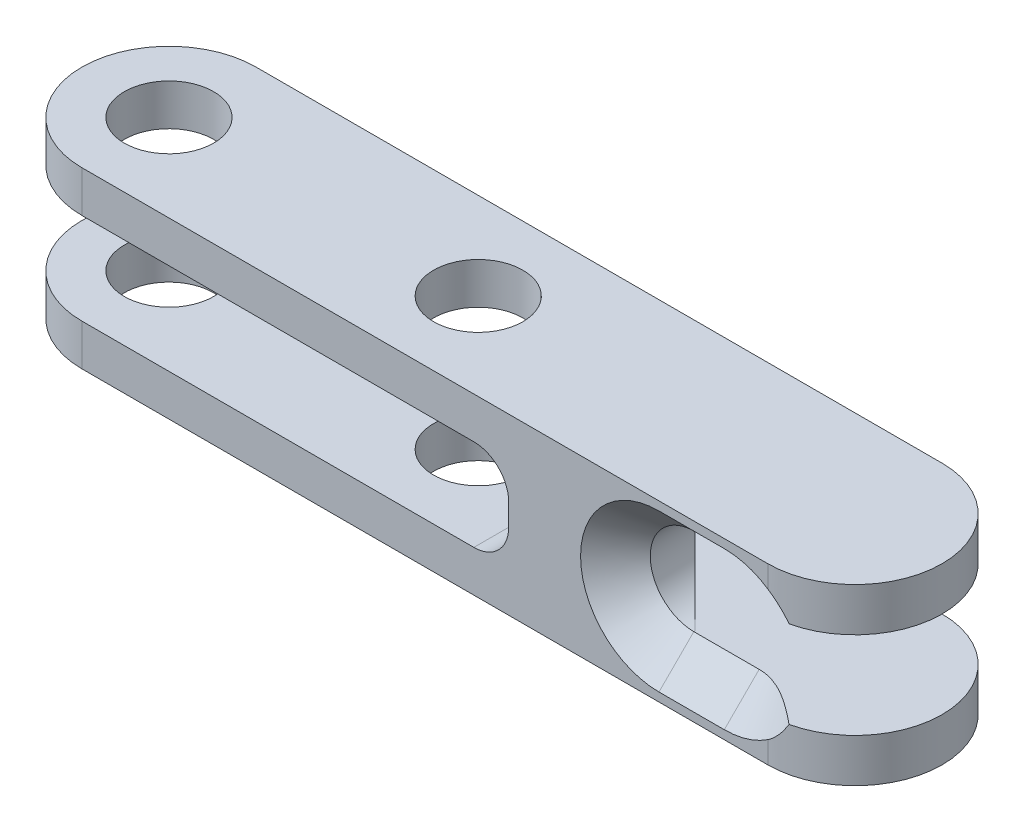
ISO-10303-21;
HEADER;
FILE_DESCRIPTION(('STEP AP214'),'2;1');
FILE_NAME('part.step','',(''),(''),'','','');
FILE_SCHEMA(('AUTOMOTIVE_DESIGN { 1 0 10303 214 1 1 1 1 }'));
ENDSEC;
DATA;
#1=APPLICATION_CONTEXT('core data for automotive mechanical design processes');
#2=APPLICATION_PROTOCOL_DEFINITION('international standard','automotive_design',2000,#1);
#3=PRODUCT_CONTEXT('',#1,'mechanical');
#4=PRODUCT('Part','Part','',(#3));
#5=PRODUCT_RELATED_PRODUCT_CATEGORY('part','',(#4));
#6=PRODUCT_DEFINITION_FORMATION('','',#4);
#7=PRODUCT_DEFINITION_CONTEXT('part definition',#1,'design');
#8=PRODUCT_DEFINITION('design','',#6,#7);
#9=PRODUCT_DEFINITION_SHAPE('','',#8);
#10=(LENGTH_UNIT() NAMED_UNIT(*) SI_UNIT(.MILLI.,.METRE.));
#11=(NAMED_UNIT(*) PLANE_ANGLE_UNIT() SI_UNIT($,.RADIAN.));
#12=(NAMED_UNIT(*) SI_UNIT($,.STERADIAN.) SOLID_ANGLE_UNIT());
#13=UNCERTAINTY_MEASURE_WITH_UNIT(LENGTH_MEASURE(1.E-05),#10,'distance_accuracy_value','');
#14=(GEOMETRIC_REPRESENTATION_CONTEXT(3) GLOBAL_UNCERTAINTY_ASSIGNED_CONTEXT((#13)) GLOBAL_UNIT_ASSIGNED_CONTEXT((#10,
#11,#12)) REPRESENTATION_CONTEXT('',''));
#15=CARTESIAN_POINT('',(0.,0.,0.));
#16=DIRECTION('',(0.,0.,1.));
#17=DIRECTION('',(1.,0.,0.));
#18=AXIS2_PLACEMENT_3D('',#15,#16,#17);
#19=CARTESIAN_POINT('',(11.,0.,8.));
#20=DIRECTION('',(0.,0.,1.));
#21=DIRECTION('',(-1.,0.,0.));
#22=AXIS2_PLACEMENT_3D('',#19,#20,#21);
#23=CYLINDRICAL_SURFACE('',#22,2.);
#24=DIRECTION('',(0.,0.,-1.));
#25=VECTOR('',#24,1.);
#26=CARTESIAN_POINT('',(11.,2.,6.4));
#27=LINE('',#26,#25);
#28=CARTESIAN_POINT('',(11.,2.,6.4));
#29=VERTEX_POINT('',#28);
#30=CARTESIAN_POINT('',(11.,2.,6.35391052434));
#31=VERTEX_POINT('',#30);
#32=EDGE_CURVE('E172',#29,#31,#27,.T.);
#33=ORIENTED_EDGE('',*,*,#32,.F.);
#34=CARTESIAN_POINT('',(11.,0.,6.4));
#35=DIRECTION('',(0.,0.,1.));
#36=DIRECTION('',(0.,1.,0.));
#37=AXIS2_PLACEMENT_3D('',#34,#35,#36);
#38=CIRCLE('',#37,2.);
#39=CARTESIAN_POINT('',(11.,-2.,6.4));
#40=VERTEX_POINT('',#39);
#41=EDGE_CURVE('E385',#29,#40,#38,.T.);
#42=ORIENTED_EDGE('',*,*,#41,.T.);
#43=DIRECTION('',(0.,0.,-1.));
#44=VECTOR('',#43,1.);
#45=CARTESIAN_POINT('',(11.,-2.,6.4));
#46=LINE('',#45,#44);
#47=CARTESIAN_POINT('',(11.,-2.,6.35391052434));
#48=VERTEX_POINT('',#47);
#49=EDGE_CURVE('E11',#40,#48,#46,.T.);
#50=ORIENTED_EDGE('',*,*,#49,.T.);
#51=CARTESIAN_POINT('',(11.,0.,6.35391052434));
#52=DIRECTION('',(-0.707106781186548,0.,0.707106781186548));
#53=DIRECTION('',(0.707106781186548,0.,0.707106781186548));
#54=AXIS2_PLACEMENT_3D('',#51,#52,#53);
#55=ELLIPSE('',#54,2.82842712474619,2.);
#56=EDGE_CURVE('E28',#31,#48,#55,.T.);
#57=ORIENTED_EDGE('',*,*,#56,.F.);
#58=EDGE_LOOP('',(#33,#42,#50,#57));
#59=FACE_BOUND('',#58,.T.);
#60=ADVANCED_FACE('F17',(#59),#23,.F.);
#61=CARTESIAN_POINT('',(11.,-2.,8.));
#62=DIRECTION('',(0.,-1.,0.));
#63=DIRECTION('',(0.,0.,-1.));
#64=AXIS2_PLACEMENT_3D('',#61,#62,#63);
#65=PLANE('',#64);
#66=CARTESIAN_POINT('',(16.8758536968895,-2.,7.90293226967255));
#67=CARTESIAN_POINT('',(15.0452077386955,-2.,6.4));
#68=CARTESIAN_POINT('',(14.,-2.,6.4));
#69=(BOUNDED_CURVE() B_SPLINE_CURVE(2,(#66,#67,#68),.UNSPECIFIED.,.F.,
.F.) B_SPLINE_CURVE_WITH_KNOTS((3,3),(0.0819922701807436,0.489367274751613),
.UNSPECIFIED.) CURVE() GEOMETRIC_REPRESENTATION_ITEM() RATIONAL_B_SPLINE_CURVE((1.1997142402842,
1.6504865518114,1.6504865518114)) REPRESENTATION_ITEM(''));
#70=CARTESIAN_POINT('',(16.87585369689,-2.,7.902932269672));
#71=VERTEX_POINT('',#70);
#72=CARTESIAN_POINT('',(14.,-2.,6.4));
#73=VERTEX_POINT('',#72);
#74=EDGE_CURVE('E498',#71,#73,#69,.T.);
#75=ORIENTED_EDGE('',*,*,#74,.F.);
#76=CARTESIAN_POINT('',(16.,-2.,4.));
#77=DIRECTION('',(0.,-1.,0.));
#78=DIRECTION('',(0.,0.,-1.));
#79=AXIS2_PLACEMENT_3D('',#76,#77,#78);
#80=CIRCLE('',#79,4.);
#81=CARTESIAN_POINT('',(16.,-2.,0.));
#82=VERTEX_POINT('',#81);
#83=EDGE_CURVE('E359',#82,#71,#80,.T.);
#84=ORIENTED_EDGE('',*,*,#83,.F.);
#85=DIRECTION('',(1.,0.,0.));
#86=VECTOR('',#85,1.);
#87=CARTESIAN_POINT('',(4.64608947566,-2.,0.));
#88=LINE('',#87,#86);
#89=CARTESIAN_POINT('',(4.64608947566,-2.,0.));
#90=VERTEX_POINT('',#89);
#91=EDGE_CURVE('E268',#90,#82,#88,.T.);
#92=ORIENTED_EDGE('',*,*,#91,.F.);
#93=DIRECTION('',(0.707106781186548,0.,0.707106781186548));
#94=VECTOR('',#93,1.);
#95=CARTESIAN_POINT('',(4.64608947566,-2.,0.));
#96=LINE('',#95,#94);
#97=EDGE_CURVE('E255',#90,#48,#96,.T.);
#98=ORIENTED_EDGE('',*,*,#97,.T.);
#99=ORIENTED_EDGE('',*,*,#49,.F.);
#100=DIRECTION('',(-1.,0.,0.));
#101=VECTOR('',#100,1.);
#102=CARTESIAN_POINT('',(14.,-2.,6.4));
#103=LINE('',#102,#101);
#104=EDGE_CURVE('E339',#73,#40,#103,.T.);
#105=ORIENTED_EDGE('',*,*,#104,.F.);
#106=EDGE_LOOP('',(#75,#84,#92,#98,#99,#105));
#107=FACE_BOUND('',#106,.T.);
#108=ADVANCED_FACE('F553',(#107),#65,.F.);
#109=CARTESIAN_POINT('',(8.32304473783,0.,3.67695526217));
#110=DIRECTION('',(-0.707106781186548,0.,0.707106781186548));
#111=DIRECTION('',(0.,1.,0.));
#112=AXIS2_PLACEMENT_3D('',#109,#110,#111);
#113=PLANE('',#112);
#114=ORIENTED_EDGE('',*,*,#97,.F.);
#115=DIRECTION('',(0.,-1.,0.));
#116=VECTOR('',#115,1.);
#117=CARTESIAN_POINT('',(4.64608947566,2.,0.));
#118=LINE('',#117,#116);
#119=CARTESIAN_POINT('',(4.64608947566,2.,0.));
#120=VERTEX_POINT('',#119);
#121=EDGE_CURVE('E273',#120,#90,#118,.T.);
#122=ORIENTED_EDGE('',*,*,#121,.F.);
#123=DIRECTION('',(-0.707106781186548,0.,-0.707106781186548));
#124=VECTOR('',#123,1.);
#125=CARTESIAN_POINT('',(11.,2.,6.35391052434));
#126=LINE('',#125,#124);
#127=EDGE_CURVE('E253',#31,#120,#126,.T.);
#128=ORIENTED_EDGE('',*,*,#127,.F.);
#129=ORIENTED_EDGE('',*,*,#56,.T.);
#130=EDGE_LOOP('',(#114,#122,#128,#129));
#131=FACE_BOUND('',#130,.T.);
#132=ADVANCED_FACE('F19',(#131),#113,.F.);
#133=CARTESIAN_POINT('',(20.,2.,8.));
#134=DIRECTION('',(0.,1.,0.));
#135=DIRECTION('',(1.,0.,0.));
#136=AXIS2_PLACEMENT_3D('',#133,#134,#135);
#137=PLANE('',#136);
#138=CARTESIAN_POINT('',(14.,2.,6.4));
#139=CARTESIAN_POINT('',(15.0452077386892,2.,6.4));
#140=CARTESIAN_POINT('',(16.8758536968591,2.,7.90293226964759));
#141=(BOUNDED_CURVE() B_SPLINE_CURVE(2,(#138,#139,#140),.UNSPECIFIED.,.F.,
.F.) B_SPLINE_CURVE_WITH_KNOTS((3,3),(0.489367274751613,0.896742279320024),
.UNSPECIFIED.) CURVE() GEOMETRIC_REPRESENTATION_ITEM() RATIONAL_B_SPLINE_CURVE((1.6504865518114,
1.6504865518114,1.19971424028964)) REPRESENTATION_ITEM(''));
#142=CARTESIAN_POINT('',(14.,2.,6.4));
#143=VERTEX_POINT('',#142);
#144=CARTESIAN_POINT('',(16.87585369689,2.,7.902932269672));
#145=VERTEX_POINT('',#144);
#146=EDGE_CURVE('E335',#143,#145,#141,.T.);
#147=ORIENTED_EDGE('',*,*,#146,.F.);
#148=DIRECTION('',(1.,0.,0.));
#149=VECTOR('',#148,1.);
#150=CARTESIAN_POINT('',(11.,2.,6.4));
#151=LINE('',#150,#149);
#152=EDGE_CURVE('E254',#29,#143,#151,.T.);
#153=ORIENTED_EDGE('',*,*,#152,.F.);
#154=ORIENTED_EDGE('',*,*,#32,.T.);
#155=ORIENTED_EDGE('',*,*,#127,.T.);
#156=DIRECTION('',(-1.,0.,0.));
#157=VECTOR('',#156,1.);
#158=CARTESIAN_POINT('',(16.,2.,0.));
#159=LINE('',#158,#157);
#160=CARTESIAN_POINT('',(16.,2.,0.));
#161=VERTEX_POINT('',#160);
#162=EDGE_CURVE('E405',#161,#120,#159,.T.);
#163=ORIENTED_EDGE('',*,*,#162,.F.);
#164=CARTESIAN_POINT('',(16.,2.,4.));
#165=DIRECTION('',(0.,1.,0.));
#166=DIRECTION('',(0.218963424222194,0.,0.975733067417975));
#167=AXIS2_PLACEMENT_3D('',#164,#165,#166);
#168=CIRCLE('',#167,4.);
#169=EDGE_CURVE('E344',#145,#161,#168,.T.);
#170=ORIENTED_EDGE('',*,*,#169,.F.);
#171=EDGE_LOOP('',(#147,#153,#154,#155,#163,#170));
#172=FACE_BOUND('',#171,.T.);
#173=ADVANCED_FACE('F753',(#172),#137,.F.);
#174=CARTESIAN_POINT('',(14.,3.6,8.));
#175=DIRECTION('',(0.,0.707106781186548,-0.707106781186548));
#176=DIRECTION('',(-1.,0.,0.));
#177=AXIS2_PLACEMENT_3D('',#174,#175,#176);
#178=PLANE('',#177);
#179=DIRECTION('',(1.,0.,0.));
#180=VECTOR('',#179,1.);
#181=CARTESIAN_POINT('',(11.,3.6,8.));
#182=LINE('',#181,#180);
#183=CARTESIAN_POINT('',(11.,3.6,8.));
#184=VERTEX_POINT('',#183);
#185=CARTESIAN_POINT('',(14.,3.6,8.));
#186=VERTEX_POINT('',#185);
#187=EDGE_CURVE('E332',#184,#186,#182,.T.);
#188=ORIENTED_EDGE('',*,*,#187,.F.);
#189=DIRECTION('',(0.,-0.707106781186548,-0.707106781186548));
#190=VECTOR('',#189,1.);
#191=CARTESIAN_POINT('',(11.,3.6,8.));
#192=LINE('',#191,#190);
#193=EDGE_CURVE('E432',#184,#29,#192,.T.);
#194=ORIENTED_EDGE('',*,*,#193,.T.);
#195=ORIENTED_EDGE('',*,*,#152,.T.);
#196=DIRECTION('',(0.,-0.707106781186548,-0.707106781186548));
#197=VECTOR('',#196,1.);
#198=CARTESIAN_POINT('',(14.,3.6,8.));
#199=LINE('',#198,#197);
#200=EDGE_CURVE('E340',#186,#143,#199,.T.);
#201=ORIENTED_EDGE('',*,*,#200,.F.);
#202=EDGE_LOOP('',(#188,#194,#195,#201));
#203=FACE_BOUND('',#202,.T.);
#204=ADVANCED_FACE('F571',(#203),#178,.F.);
#205=CARTESIAN_POINT('',(11.,0.,7.2));
#206=DIRECTION('',(0.,0.,1.));
#207=DIRECTION('',(-1.,0.,0.));
#208=AXIS2_PLACEMENT_3D('',#205,#206,#207);
#209=CONICAL_SURFACE('',#208,2.8,0.785398163397448);
#210=CARTESIAN_POINT('',(11.,0.,8.));
#211=DIRECTION('',(0.,0.,1.));
#212=DIRECTION('',(0.,1.,0.));
#213=AXIS2_PLACEMENT_3D('',#210,#211,#212);
#214=CIRCLE('',#213,3.6);
#215=CARTESIAN_POINT('',(11.,-3.6,8.));
#216=VERTEX_POINT('',#215);
#217=EDGE_CURVE('E399',#184,#216,#214,.T.);
#218=ORIENTED_EDGE('',*,*,#217,.T.);
#219=DIRECTION('',(0.,0.707106781186548,-0.707106781186548));
#220=VECTOR('',#219,1.);
#221=CARTESIAN_POINT('',(11.,-3.6,8.));
#222=LINE('',#221,#220);
#223=EDGE_CURVE('E382',#216,#40,#222,.T.);
#224=ORIENTED_EDGE('',*,*,#223,.T.);
#225=ORIENTED_EDGE('',*,*,#41,.F.);
#226=ORIENTED_EDGE('',*,*,#193,.F.);
#227=EDGE_LOOP('',(#218,#224,#225,#226));
#228=FACE_BOUND('',#227,.T.);
#229=ADVANCED_FACE('F566',(#228),#209,.F.);
#230=CARTESIAN_POINT('',(11.,-3.6,8.));
#231=DIRECTION('',(0.,-0.707106781186548,-0.707106781186548));
#232=DIRECTION('',(0.,-0.707106781186548,0.707106781186548));
#233=AXIS2_PLACEMENT_3D('',#230,#231,#232);
#234=PLANE('',#233);
#235=DIRECTION('',(-1.,0.,0.));
#236=VECTOR('',#235,1.);
#237=CARTESIAN_POINT('',(14.,-3.6,8.));
#238=LINE('',#237,#236);
#239=CARTESIAN_POINT('',(14.,-3.6,8.));
#240=VERTEX_POINT('',#239);
#241=EDGE_CURVE('E396',#240,#216,#238,.T.);
#242=ORIENTED_EDGE('',*,*,#241,.F.);
#243=DIRECTION('',(0.,0.707106781186548,-0.707106781186548));
#244=VECTOR('',#243,1.);
#245=CARTESIAN_POINT('',(14.,-3.6,8.));
#246=LINE('',#245,#244);
#247=EDGE_CURVE('E491',#240,#73,#246,.T.);
#248=ORIENTED_EDGE('',*,*,#247,.T.);
#249=ORIENTED_EDGE('',*,*,#104,.T.);
#250=ORIENTED_EDGE('',*,*,#223,.F.);
#251=EDGE_LOOP('',(#242,#248,#249,#250));
#252=FACE_BOUND('',#251,.T.);
#253=ADVANCED_FACE('F307',(#252),#234,.F.);
#254=CARTESIAN_POINT('',(14.,0.,7.2));
#255=DIRECTION('',(0.,0.,1.));
#256=DIRECTION('',(1.,0.,0.));
#257=AXIS2_PLACEMENT_3D('',#254,#255,#256);
#258=CONICAL_SURFACE('',#257,2.8,0.785398163397448);
#259=CARTESIAN_POINT('',(14.,0.,8.));
#260=DIRECTION('',(0.,0.,1.));
#261=DIRECTION('',(0.555555555555585,0.831479419283078,0.));
#262=AXIS2_PLACEMENT_3D('',#259,#260,#261);
#263=CIRCLE('',#262,3.6);
#264=CARTESIAN_POINT('',(16.,2.993325909419,8.));
#265=VERTEX_POINT('',#264);
#266=EDGE_CURVE('E326',#265,#186,#263,.T.);
#267=ORIENTED_EDGE('',*,*,#266,.T.);
#268=ORIENTED_EDGE('',*,*,#200,.T.);
#269=ORIENTED_EDGE('',*,*,#146,.T.);
#270=CARTESIAN_POINT('',(16.0000000000001,2.9933259094191,8.));
#271=CARTESIAN_POINT('',(16.0224915069229,2.97829905344923,8.00000003885575));
#272=CARTESIAN_POINT('',(16.0447102397676,2.96286612871863,7.99981030326187));
#273=CARTESIAN_POINT('',(16.0887664823905,2.93109616731914,7.99907611899545));
#274=CARTESIAN_POINT('',(16.1105993066032,2.9147526976776,7.99852874360516));
#275=CARTESIAN_POINT('',(16.1538781539454,2.88116203598733,7.99709829343307));
#276=CARTESIAN_POINT('',(16.1753185723437,2.8639077634715,7.99621209528173));
#277=CARTESIAN_POINT('',(16.2178090094902,2.82849619626333,7.99412273839618));
#278=CARTESIAN_POINT('',(16.238852526575,2.81033129732153,7.99291633557615));
#279=CARTESIAN_POINT('',(16.2805457383029,2.77309893893066,7.99020495253355));
#280=CARTESIAN_POINT('',(16.3011880577053,2.75402346755369,7.98869667873485));
#281=CARTESIAN_POINT('',(16.3420760697076,2.71497034454879,7.98539959155891));
#282=CARTESIAN_POINT('',(16.3623135566439,2.6949843857587,7.98360750113152));
#283=CARTESIAN_POINT('',(16.402389521483,2.65411053492415,7.97976045936891));
#284=CARTESIAN_POINT('',(16.4222190169045,2.63321414490692,7.9777023070478));
#285=CARTESIAN_POINT('',(16.4614771429398,2.59051963107893,7.97334046579657));
#286=CARTESIAN_POINT('',(16.4808960793296,2.56871291506976,7.97103370456857));
#287=CARTESIAN_POINT('',(16.5175834550042,2.52622200497297,7.96641177913506));
#288=CARTESIAN_POINT('',(16.5349025980334,2.50557999974217,7.96411082982408));
#289=CARTESIAN_POINT('',(16.5690705008021,2.46368877178148,7.95935075028315));
#290=CARTESIAN_POINT('',(16.5859151732989,2.4424363342928,7.95689063512042));
#291=CARTESIAN_POINT('',(16.6359436591069,2.37750835844558,7.94926864547722));
#292=CARTESIAN_POINT('',(16.668208386484,2.33314177371084,7.94391817204601));
#293=CARTESIAN_POINT('',(16.7308782748958,2.24199684148729,7.93279160436495));
#294=CARTESIAN_POINT('',(16.7612402096858,2.1951896485661,7.92700963688275));
#295=CARTESIAN_POINT('',(16.8201253570681,2.09915938130517,7.91513822048525));
#296=CARTESIAN_POINT('',(16.8485995836132,2.04990670034087,7.90904493306346));
#297=CARTESIAN_POINT('',(16.875853696889,1.99999999999949,7.90293226967185));
#298=B_SPLINE_CURVE_WITH_KNOTS('',3,(#270,#271,#272,#273,#274,#275,#276,#277,#278,#279,#280,
#281,#282,#283,#284,#285,#286,#287,#288,#289,#290,#291,#292,#293,#294,#295,#296,#297),
.UNSPECIFIED.,.F.,.F.,(4,2,2,2,2,2,2,2,2,2,2,2,2,4),(0.,0.0811415856839439,0.162955647180246,
0.245542824469501,0.329000960810951,0.413424871388967,0.498906157828172,0.585533067590855,
0.673390396139254,0.754509076416318,0.836189422238525,1.00145394013642,1.16965484701914,
1.34122345287766),.UNSPECIFIED.);
#299=EDGE_CURVE('E349',#265,#145,#298,.T.);
#300=ORIENTED_EDGE('',*,*,#299,.F.);
#301=EDGE_LOOP('',(#267,#268,#269,#300));
#302=FACE_BOUND('',#301,.T.);
#303=ADVANCED_FACE('F303',(#302),#258,.F.);
#304=CARTESIAN_POINT('',(14.,0.,7.2));
#305=DIRECTION('',(0.,0.,1.));
#306=DIRECTION('',(1.,0.,0.));
#307=AXIS2_PLACEMENT_3D('',#304,#305,#306);
#308=CONICAL_SURFACE('',#307,2.8,0.785398163397448);
#309=CARTESIAN_POINT('',(14.,0.,8.));
#310=DIRECTION('',(0.,0.,1.));
#311=DIRECTION('',(0.,-1.,0.));
#312=AXIS2_PLACEMENT_3D('',#309,#310,#311);
#313=CIRCLE('',#312,3.6);
#314=CARTESIAN_POINT('',(16.,-2.993325909419,8.));
#315=VERTEX_POINT('',#314);
#316=EDGE_CURVE('E400',#240,#315,#313,.T.);
#317=ORIENTED_EDGE('',*,*,#316,.T.);
#318=CARTESIAN_POINT('',(16.875853696889,-1.99999999999949,7.90293226967185));
#319=CARTESIAN_POINT('',(16.8486026514018,-2.04990114553888,7.9090442549597));
#320=CARTESIAN_POINT('',(16.8201313932764,-2.09914816597659,7.91513693391774));
#321=CARTESIAN_POINT('',(16.7612503517902,-2.19517096180513,7.92700766103227));
#322=CARTESIAN_POINT('',(16.7308893677579,-2.2419762311644,7.93278953206859));
#323=CARTESIAN_POINT('',(16.6682195359823,-2.33312116260852,7.9439162933443));
#324=CARTESIAN_POINT('',(16.6359537207356,-2.37748954087893,7.94926703241388));
#325=CARTESIAN_POINT('',(16.5859230980867,-2.44242183595486,7.95688946734179));
#326=CARTESIAN_POINT('',(16.5690771133668,-2.46367657646038,7.95934980483063));
#327=CARTESIAN_POINT('',(16.534906173291,-2.50557343351776,7.96411035579218));
#328=CARTESIAN_POINT('',(16.5175852806241,-2.52621874526678,7.96641154911607));
#329=CARTESIAN_POINT('',(16.4808986966937,-2.56871112380369,7.97103337485645));
#330=CARTESIAN_POINT('',(16.4614824541241,-2.59051613140401,7.97333983637527));
#331=CARTESIAN_POINT('',(16.4222288945358,-2.63320766491099,7.9777012483212));
#332=CARTESIAN_POINT('',(16.4024012556647,-2.65410276858955,7.97975926347833));
#333=CARTESIAN_POINT('',(16.362328297367,-2.69497458981829,7.98360615463261));
#334=CARTESIAN_POINT('',(16.3420919417471,-2.71495978760885,7.98539822368637));
#335=CARTESIAN_POINT('',(16.3012054519676,-2.75401190611607,7.98869536295125));
#336=CARTESIAN_POINT('',(16.2805635044232,-2.77308711468781,7.99020370159638));
#337=CARTESIAN_POINT('',(16.2388703019864,-2.81031947406259,7.99291527400826));
#338=CARTESIAN_POINT('',(16.2178264026635,-2.82848461546274,7.99412179205018));
#339=CARTESIAN_POINT('',(16.1753344630016,-2.86389719440565,7.99621140396134));
#340=CARTESIAN_POINT('',(16.1538929044437,-2.88115221299794,7.99709773186852));
#341=CARTESIAN_POINT('',(16.1106110389544,-2.91474489529435,7.99852842911427));
#342=CARTESIAN_POINT('',(16.0887763169289,-2.93108961448746,7.99907591100631));
#343=CARTESIAN_POINT('',(16.0447155402365,-2.9628626077071,7.99981025866226));
#344=CARTESIAN_POINT('',(16.0224941517586,-2.97829728812241,8.00000003954653));
#345=CARTESIAN_POINT('',(16.0000000000001,-2.9933259094191,8.));
#346=B_SPLINE_CURVE_WITH_KNOTS('',3,(#318,#319,#320,#321,#322,#323,#324,#325,#326,#327,#328,
#329,#330,#331,#332,#333,#334,#335,#336,#337,#338,#339,#340,#341,#342,#343,#344,#345),
.UNSPECIFIED.,.F.,.F.,(4,2,2,2,2,2,2,2,2,2,2,2,2,4),(0.,0.171549400454666,0.33974392110856,
0.505014792401834,0.586703033967209,0.667832714448499,0.755680794168464,0.84230104860963,
0.927778315592473,1.01220087876991,1.09566036879811,1.17825162176194,1.26007249277091,
1.3412236237751),.UNSPECIFIED.);
#347=EDGE_CURVE('E282',#71,#315,#346,.T.);
#348=ORIENTED_EDGE('',*,*,#347,.F.);
#349=ORIENTED_EDGE('',*,*,#74,.T.);
#350=ORIENTED_EDGE('',*,*,#247,.F.);
#351=EDGE_LOOP('',(#317,#348,#349,#350));
#352=FACE_BOUND('',#351,.T.);
#353=ADVANCED_FACE('F300',(#352),#308,.F.);
#354=CARTESIAN_POINT('',(16.,-4.,4.));
#355=DIRECTION('',(0.,-1.,0.));
#356=DIRECTION('',(1.,0.,0.));
#357=AXIS2_PLACEMENT_3D('',#354,#355,#356);
#358=CYLINDRICAL_SURFACE('',#357,4.);
#359=ORIENTED_EDGE('',*,*,#347,.T.);
#360=DIRECTION('',(0.,-1.,0.));
#361=VECTOR('',#360,1.);
#362=CARTESIAN_POINT('',(16.,-2.993325909419,8.));
#363=LINE('',#362,#361);
#364=CARTESIAN_POINT('',(16.,-4.,8.));
#365=VERTEX_POINT('',#364);
#366=EDGE_CURVE('E87',#315,#365,#363,.T.);
#367=ORIENTED_EDGE('',*,*,#366,.T.);
#368=CARTESIAN_POINT('',(16.,-4.,4.));
#369=DIRECTION('',(0.,1.,0.));
#370=DIRECTION('',(0.,0.,1.));
#371=AXIS2_PLACEMENT_3D('',#368,#369,#370);
#372=CIRCLE('',#371,4.);
#373=CARTESIAN_POINT('',(16.,-4.,0.));
#374=VERTEX_POINT('',#373);
#375=EDGE_CURVE('E413',#365,#374,#372,.T.);
#376=ORIENTED_EDGE('',*,*,#375,.T.);
#377=DIRECTION('',(0.,-1.,0.));
#378=VECTOR('',#377,1.);
#379=CARTESIAN_POINT('',(16.,-2.,0.));
#380=LINE('',#379,#378);
#381=EDGE_CURVE('E272',#82,#374,#380,.T.);
#382=ORIENTED_EDGE('',*,*,#381,.F.);
#383=ORIENTED_EDGE('',*,*,#83,.T.);
#384=EDGE_LOOP('',(#359,#367,#376,#382,#383));
#385=FACE_BOUND('',#384,.T.);
#386=ADVANCED_FACE('F289',(#385),#358,.T.);
#387=CARTESIAN_POINT('',(16.,-4.,4.));
#388=DIRECTION('',(0.,-1.,0.));
#389=DIRECTION('',(1.,0.,0.));
#390=AXIS2_PLACEMENT_3D('',#387,#388,#389);
#391=CYLINDRICAL_SURFACE('',#390,4.);
#392=ORIENTED_EDGE('',*,*,#299,.T.);
#393=ORIENTED_EDGE('',*,*,#169,.T.);
#394=DIRECTION('',(0.,-1.,0.));
#395=VECTOR('',#394,1.);
#396=CARTESIAN_POINT('',(16.,4.,0.));
#397=LINE('',#396,#395);
#398=CARTESIAN_POINT('',(16.,4.,0.));
#399=VERTEX_POINT('',#398);
#400=EDGE_CURVE('E478',#399,#161,#397,.T.);
#401=ORIENTED_EDGE('',*,*,#400,.F.);
#402=CARTESIAN_POINT('',(16.,4.,4.));
#403=DIRECTION('',(0.,-1.,0.));
#404=DIRECTION('',(0.,0.,-1.));
#405=AXIS2_PLACEMENT_3D('',#402,#403,#404);
#406=CIRCLE('',#405,4.);
#407=CARTESIAN_POINT('',(16.,4.,8.));
#408=VERTEX_POINT('',#407);
#409=EDGE_CURVE('E387',#399,#408,#406,.T.);
#410=ORIENTED_EDGE('',*,*,#409,.T.);
#411=DIRECTION('',(0.,-1.,0.));
#412=VECTOR('',#411,1.);
#413=CARTESIAN_POINT('',(16.,4.,8.));
#414=LINE('',#413,#412);
#415=EDGE_CURVE('E317',#408,#265,#414,.T.);
#416=ORIENTED_EDGE('',*,*,#415,.T.);
#417=EDGE_LOOP('',(#392,#393,#401,#410,#416));
#418=FACE_BOUND('',#417,.T.);
#419=ADVANCED_FACE('F299',(#418),#391,.T.);
#420=CARTESIAN_POINT('',(2.5,-0.5,18.4288));
#421=DIRECTION('',(0.,0.,-1.));
#422=DIRECTION('',(1.,0.,0.));
#423=AXIS2_PLACEMENT_3D('',#420,#421,#422);
#424=CYLINDRICAL_SURFACE('',#423,1.6);
#425=DIRECTION('',(0.,0.,-1.));
#426=VECTOR('',#425,1.);
#427=CARTESIAN_POINT('',(4.1,-0.5,8.));
#428=LINE('',#427,#426);
#429=CARTESIAN_POINT('',(4.1,-0.5,8.));
#430=VERTEX_POINT('',#429);
#431=CARTESIAN_POINT('',(4.1,-0.5,0.));
#432=VERTEX_POINT('',#431);
#433=EDGE_CURVE('E211',#430,#432,#428,.T.);
#434=ORIENTED_EDGE('',*,*,#433,.T.);
#435=CARTESIAN_POINT('',(2.5,-0.5,0.));
#436=DIRECTION('',(0.,0.,1.));
#437=DIRECTION('',(0.,-1.,0.));
#438=AXIS2_PLACEMENT_3D('',#435,#436,#437);
#439=CIRCLE('',#438,1.6);
#440=CARTESIAN_POINT('',(2.5,-2.1,0.));
#441=VERTEX_POINT('',#440);
#442=EDGE_CURVE('E215',#441,#432,#439,.T.);
#443=ORIENTED_EDGE('',*,*,#442,.F.);
#444=DIRECTION('',(0.,0.,-1.));
#445=VECTOR('',#444,1.);
#446=CARTESIAN_POINT('',(2.5,-2.1,8.));
#447=LINE('',#446,#445);
#448=CARTESIAN_POINT('',(2.5,-2.1,8.));
#449=VERTEX_POINT('',#448);
#450=EDGE_CURVE('E417',#449,#441,#447,.T.);
#451=ORIENTED_EDGE('',*,*,#450,.F.);
#452=CARTESIAN_POINT('',(2.5,-0.5,8.));
#453=DIRECTION('',(0.,0.,-1.));
#454=DIRECTION('',(1.,0.,0.));
#455=AXIS2_PLACEMENT_3D('',#452,#453,#454);
#456=CIRCLE('',#455,1.6);
#457=EDGE_CURVE('E217',#430,#449,#456,.T.);
#458=ORIENTED_EDGE('',*,*,#457,.F.);
#459=EDGE_LOOP('',(#434,#443,#451,#458));
#460=FACE_BOUND('',#459,.T.);
#461=ADVANCED_FACE('F213',(#460),#424,.F.);
#462=CARTESIAN_POINT('',(0.,0.,8.));
#463=DIRECTION('',(0.,0.,1.));
#464=DIRECTION('',(1.,0.,0.));
#465=AXIS2_PLACEMENT_3D('',#462,#463,#464);
#466=PLANE('',#465);
#467=DIRECTION('',(1.,0.,0.));
#468=VECTOR('',#467,1.);
#469=CARTESIAN_POINT('',(-15.5,-2.1,8.));
#470=LINE('',#469,#468);
#471=CARTESIAN_POINT('',(-15.5,-2.1,8.));
#472=VERTEX_POINT('',#471);
#473=EDGE_CURVE('E471',#472,#449,#470,.T.);
#474=ORIENTED_EDGE('',*,*,#473,.F.);
#475=DIRECTION('',(0.,-1.,0.));
#476=VECTOR('',#475,1.);
#477=CARTESIAN_POINT('',(-15.5,-2.1,8.));
#478=LINE('',#477,#476);
#479=CARTESIAN_POINT('',(-15.5,-4.,8.));
#480=VERTEX_POINT('',#479);
#481=EDGE_CURVE('E103',#472,#480,#478,.T.);
#482=ORIENTED_EDGE('',*,*,#481,.T.);
#483=DIRECTION('',(1.,0.,0.));
#484=VECTOR('',#483,1.);
#485=CARTESIAN_POINT('',(-15.5,-4.,8.));
#486=LINE('',#485,#484);
#487=EDGE_CURVE('E409',#480,#365,#486,.T.);
#488=ORIENTED_EDGE('',*,*,#487,.T.);
#489=ORIENTED_EDGE('',*,*,#366,.F.);
#490=ORIENTED_EDGE('',*,*,#316,.F.);
#491=ORIENTED_EDGE('',*,*,#241,.T.);
#492=ORIENTED_EDGE('',*,*,#217,.F.);
#493=ORIENTED_EDGE('',*,*,#187,.T.);
#494=ORIENTED_EDGE('',*,*,#266,.F.);
#495=ORIENTED_EDGE('',*,*,#415,.F.);
#496=DIRECTION('',(-1.,0.,0.));
#497=VECTOR('',#496,1.);
#498=CARTESIAN_POINT('',(16.,4.,8.));
#499=LINE('',#498,#497);
#500=CARTESIAN_POINT('',(-15.5,4.,8.));
#501=VERTEX_POINT('',#500);
#502=EDGE_CURVE('E392',#408,#501,#499,.T.);
#503=ORIENTED_EDGE('',*,*,#502,.T.);
#504=DIRECTION('',(0.,-1.,0.));
#505=VECTOR('',#504,1.);
#506=CARTESIAN_POINT('',(-15.5,4.,8.));
#507=LINE('',#506,#505);
#508=CARTESIAN_POINT('',(-15.5,2.1,8.));
#509=VERTEX_POINT('',#508);
#510=EDGE_CURVE('E391',#501,#509,#507,.T.);
#511=ORIENTED_EDGE('',*,*,#510,.T.);
#512=DIRECTION('',(1.,0.,0.));
#513=VECTOR('',#512,1.);
#514=CARTESIAN_POINT('',(-15.5,2.1,8.));
#515=LINE('',#514,#513);
#516=CARTESIAN_POINT('',(2.5,2.1,8.));
#517=VERTEX_POINT('',#516);
#518=EDGE_CURVE('E266',#509,#517,#515,.T.);
#519=ORIENTED_EDGE('',*,*,#518,.T.);
#520=CARTESIAN_POINT('',(2.5,0.5,8.));
#521=DIRECTION('',(0.,0.,-1.));
#522=DIRECTION('',(0.,1.,0.));
#523=AXIS2_PLACEMENT_3D('',#520,#521,#522);
#524=CIRCLE('',#523,1.6);
#525=CARTESIAN_POINT('',(4.1,0.5,8.));
#526=VERTEX_POINT('',#525);
#527=EDGE_CURVE('E263',#517,#526,#524,.T.);
#528=ORIENTED_EDGE('',*,*,#527,.T.);
#529=DIRECTION('',(0.,1.,0.));
#530=VECTOR('',#529,1.);
#531=CARTESIAN_POINT('',(4.1,-0.5,8.));
#532=LINE('',#531,#530);
#533=EDGE_CURVE('E223',#430,#526,#532,.T.);
#534=ORIENTED_EDGE('',*,*,#533,.F.);
#535=ORIENTED_EDGE('',*,*,#457,.T.);
#536=EDGE_LOOP('',(#474,#482,#488,#489,#490,#491,#492,#493,#494,#495,#503,#511,#519,#528,#534,#535));
#537=FACE_BOUND('',#536,.T.);
#538=ADVANCED_FACE('F539',(#537),#466,.T.);
#539=CARTESIAN_POINT('',(-15.5,-4.,4.));
#540=DIRECTION('',(0.,-1.,0.));
#541=DIRECTION('',(-1.,0.,0.));
#542=AXIS2_PLACEMENT_3D('',#539,#540,#541);
#543=CYLINDRICAL_SURFACE('',#542,4.);
#544=DIRECTION('',(0.,-1.,0.));
#545=VECTOR('',#544,1.);
#546=CARTESIAN_POINT('',(-15.5,-2.1,0.));
#547=LINE('',#546,#545);
#548=CARTESIAN_POINT('',(-15.5,-2.1,0.));
#549=VERTEX_POINT('',#548);
#550=CARTESIAN_POINT('',(-15.5,-4.,0.));
#551=VERTEX_POINT('',#550);
#552=EDGE_CURVE('E408',#549,#551,#547,.T.);
#553=ORIENTED_EDGE('',*,*,#552,.T.);
#554=CARTESIAN_POINT('',(-15.5,-4.,4.));
#555=DIRECTION('',(0.,-1.,0.));
#556=DIRECTION('',(0.,0.,1.));
#557=AXIS2_PLACEMENT_3D('',#554,#555,#556);
#558=CIRCLE('',#557,4.);
#559=EDGE_CURVE('E277',#480,#551,#558,.T.);
#560=ORIENTED_EDGE('',*,*,#559,.F.);
#561=ORIENTED_EDGE('',*,*,#481,.F.);
#562=CARTESIAN_POINT('',(-15.5,-2.1,4.));
#563=DIRECTION('',(0.,-1.,0.));
#564=DIRECTION('',(0.,0.,1.));
#565=AXIS2_PLACEMENT_3D('',#562,#563,#564);
#566=CIRCLE('',#565,4.);
#567=EDGE_CURVE('E474',#472,#549,#566,.T.);
#568=ORIENTED_EDGE('',*,*,#567,.T.);
#569=EDGE_LOOP('',(#553,#560,#561,#568));
#570=FACE_BOUND('',#569,.T.);
#571=ADVANCED_FACE('F537',(#570),#543,.T.);
#572=CARTESIAN_POINT('',(-15.5,-4.,4.));
#573=DIRECTION('',(0.,-1.,0.));
#574=DIRECTION('',(-1.,0.,0.));
#575=AXIS2_PLACEMENT_3D('',#572,#573,#574);
#576=CYLINDRICAL_SURFACE('',#575,4.);
#577=DIRECTION('',(0.,-1.,0.));
#578=VECTOR('',#577,1.);
#579=CARTESIAN_POINT('',(-15.5,4.,0.));
#580=LINE('',#579,#578);
#581=CARTESIAN_POINT('',(-15.5,4.,0.));
#582=VERTEX_POINT('',#581);
#583=CARTESIAN_POINT('',(-15.5,2.1,0.));
#584=VERTEX_POINT('',#583);
#585=EDGE_CURVE('E258',#582,#584,#580,.T.);
#586=ORIENTED_EDGE('',*,*,#585,.T.);
#587=CARTESIAN_POINT('',(-15.5,2.1,4.));
#588=DIRECTION('',(0.,-1.,0.));
#589=DIRECTION('',(0.,0.,1.));
#590=AXIS2_PLACEMENT_3D('',#587,#588,#589);
#591=CIRCLE('',#590,4.);
#592=EDGE_CURVE('E420',#509,#584,#591,.T.);
#593=ORIENTED_EDGE('',*,*,#592,.F.);
#594=ORIENTED_EDGE('',*,*,#510,.F.);
#595=CARTESIAN_POINT('',(-15.5,4.,4.));
#596=DIRECTION('',(0.,-1.,0.));
#597=DIRECTION('',(0.,0.,1.));
#598=AXIS2_PLACEMENT_3D('',#595,#596,#597);
#599=CIRCLE('',#598,4.);
#600=EDGE_CURVE('E380',#501,#582,#599,.T.);
#601=ORIENTED_EDGE('',*,*,#600,.T.);
#602=EDGE_LOOP('',(#586,#593,#594,#601));
#603=FACE_BOUND('',#602,.T.);
#604=ADVANCED_FACE('F547',(#603),#576,.T.);
#605=CARTESIAN_POINT('',(20.,4.,0.));
#606=DIRECTION('',(0.,1.,0.));
#607=DIRECTION('',(1.,0.,0.));
#608=AXIS2_PLACEMENT_3D('',#605,#606,#607);
#609=PLANE('',#608);
#610=CARTESIAN_POINT('',(-15.5,4.,4.));
#611=DIRECTION('',(0.,1.,0.));
#612=DIRECTION('',(-1.,0.,0.));
#613=AXIS2_PLACEMENT_3D('',#610,#611,#612);
#614=CIRCLE('',#613,2.05);
#615=CARTESIAN_POINT('',(-13.45,4.,4.));
#616=VERTEX_POINT('',#615);
#617=EDGE_CURVE('E274',#616,#616,#614,.T.);
#618=ORIENTED_EDGE('',*,*,#617,.F.);
#619=EDGE_LOOP('',(#618));
#620=FACE_BOUND('',#619,.T.);
#621=CARTESIAN_POINT('',(-1.3,4.,4.));
#622=DIRECTION('',(0.,1.,0.));
#623=DIRECTION('',(-1.,0.,0.));
#624=AXIS2_PLACEMENT_3D('',#621,#622,#623);
#625=CIRCLE('',#624,2.05);
#626=CARTESIAN_POINT('',(0.75,4.,4.));
#627=VERTEX_POINT('',#626);
#628=EDGE_CURVE('E377',#627,#627,#625,.T.);
#629=ORIENTED_EDGE('',*,*,#628,.F.);
#630=EDGE_LOOP('',(#629));
#631=FACE_BOUND('',#630,.T.);
#632=ORIENTED_EDGE('',*,*,#600,.F.);
#633=ORIENTED_EDGE('',*,*,#502,.F.);
#634=ORIENTED_EDGE('',*,*,#409,.F.);
#635=DIRECTION('',(-1.,0.,0.));
#636=VECTOR('',#635,1.);
#637=CARTESIAN_POINT('',(16.,4.,0.));
#638=LINE('',#637,#636);
#639=EDGE_CURVE('E262',#399,#582,#638,.T.);
#640=ORIENTED_EDGE('',*,*,#639,.T.);
#641=EDGE_LOOP('',(#632,#633,#634,#640));
#642=FACE_BOUND('',#641,.T.);
#643=ADVANCED_FACE('F604',(#620,#631,#642),#609,.T.);
#644=CARTESIAN_POINT('',(-1.3,-4.,4.));
#645=DIRECTION('',(0.,1.,0.));
#646=DIRECTION('',(-1.,0.,0.));
#647=AXIS2_PLACEMENT_3D('',#644,#645,#646);
#648=CYLINDRICAL_SURFACE('',#647,2.05);
#649=CARTESIAN_POINT('',(-1.3,2.1,4.));
#650=DIRECTION('',(0.,1.,0.));
#651=DIRECTION('',(-1.,0.,0.));
#652=AXIS2_PLACEMENT_3D('',#649,#650,#651);
#653=CIRCLE('',#652,2.05);
#654=CARTESIAN_POINT('',(0.75,2.1,4.));
#655=VERTEX_POINT('',#654);
#656=EDGE_CURVE('E423',#655,#655,#653,.T.);
#657=ORIENTED_EDGE('',*,*,#656,.F.);
#658=DIRECTION('',(0.,1.,0.));
#659=VECTOR('',#658,1.);
#660=CARTESIAN_POINT('',(0.75,-4.,4.));
#661=LINE('',#660,#659);
#662=EDGE_CURVE('E381',#655,#627,#661,.T.);
#663=ORIENTED_EDGE('',*,*,#662,.T.);
#664=ORIENTED_EDGE('',*,*,#628,.T.);
#665=ORIENTED_EDGE('',*,*,#662,.F.);
#666=EDGE_LOOP('',(#657,#663,#664,#665));
#667=FACE_BOUND('',#666,.T.);
#668=ADVANCED_FACE('F606',(#667),#648,.F.);
#669=CARTESIAN_POINT('',(-1.3,-4.,4.));
#670=DIRECTION('',(0.,1.,0.));
#671=DIRECTION('',(-1.,0.,0.));
#672=AXIS2_PLACEMENT_3D('',#669,#670,#671);
#673=CYLINDRICAL_SURFACE('',#672,2.05);
#674=CARTESIAN_POINT('',(-1.3,-4.,4.));
#675=DIRECTION('',(0.,1.,0.));
#676=DIRECTION('',(-1.,0.,0.));
#677=AXIS2_PLACEMENT_3D('',#674,#675,#676);
#678=CIRCLE('',#677,2.05);
#679=CARTESIAN_POINT('',(0.75,-4.,4.));
#680=VERTEX_POINT('',#679);
#681=EDGE_CURVE('E412',#680,#680,#678,.T.);
#682=ORIENTED_EDGE('',*,*,#681,.F.);
#683=DIRECTION('',(0.,1.,0.));
#684=VECTOR('',#683,1.);
#685=CARTESIAN_POINT('',(0.75,-4.,4.));
#686=LINE('',#685,#684);
#687=CARTESIAN_POINT('',(0.75,-2.1,4.));
#688=VERTEX_POINT('',#687);
#689=EDGE_CURVE('E427',#680,#688,#686,.T.);
#690=ORIENTED_EDGE('',*,*,#689,.T.);
#691=CARTESIAN_POINT('',(-1.3,-2.1,4.));
#692=DIRECTION('',(0.,1.,0.));
#693=DIRECTION('',(-1.,0.,0.));
#694=AXIS2_PLACEMENT_3D('',#691,#692,#693);
#695=CIRCLE('',#694,2.05);
#696=EDGE_CURVE('E430',#688,#688,#695,.T.);
#697=ORIENTED_EDGE('',*,*,#696,.T.);
#698=ORIENTED_EDGE('',*,*,#689,.F.);
#699=EDGE_LOOP('',(#682,#690,#697,#698));
#700=FACE_BOUND('',#699,.T.);
#701=ADVANCED_FACE('F510',(#700),#673,.F.);
#702=CARTESIAN_POINT('',(-20.,-2.1,8.));
#703=DIRECTION('',(0.,-1.,0.));
#704=DIRECTION('',(0.,0.,-1.));
#705=AXIS2_PLACEMENT_3D('',#702,#703,#704);
#706=PLANE('',#705);
#707=CARTESIAN_POINT('',(-15.5,-2.1,4.));
#708=DIRECTION('',(0.,1.,0.));
#709=DIRECTION('',(-1.,0.,0.));
#710=AXIS2_PLACEMENT_3D('',#707,#708,#709);
#711=CIRCLE('',#710,2.05);
#712=CARTESIAN_POINT('',(-13.45,-2.1,4.));
#713=VERTEX_POINT('',#712);
#714=EDGE_CURVE('E485',#713,#713,#711,.T.);
#715=ORIENTED_EDGE('',*,*,#714,.F.);
#716=EDGE_LOOP('',(#715));
#717=FACE_BOUND('',#716,.T.);
#718=ORIENTED_EDGE('',*,*,#696,.F.);
#719=EDGE_LOOP('',(#718));
#720=FACE_BOUND('',#719,.T.);
#721=ORIENTED_EDGE('',*,*,#450,.T.);
#722=DIRECTION('',(1.,0.,0.));
#723=VECTOR('',#722,1.);
#724=CARTESIAN_POINT('',(-15.5,-2.1,0.));
#725=LINE('',#724,#723);
#726=EDGE_CURVE('E233',#549,#441,#725,.T.);
#727=ORIENTED_EDGE('',*,*,#726,.F.);
#728=ORIENTED_EDGE('',*,*,#567,.F.);
#729=ORIENTED_EDGE('',*,*,#473,.T.);
#730=EDGE_LOOP('',(#721,#727,#728,#729));
#731=FACE_BOUND('',#730,.T.);
#732=ADVANCED_FACE('F512',(#717,#720,#731),#706,.F.);
#733=CARTESIAN_POINT('',(-20.5,-4.,0.));
#734=DIRECTION('',(0.,-1.,0.));
#735=DIRECTION('',(0.,0.,-1.));
#736=AXIS2_PLACEMENT_3D('',#733,#734,#735);
#737=PLANE('',#736);
#738=CARTESIAN_POINT('',(-15.5,-4.,4.));
#739=DIRECTION('',(0.,1.,0.));
#740=DIRECTION('',(-1.,0.,0.));
#741=AXIS2_PLACEMENT_3D('',#738,#739,#740);
#742=CIRCLE('',#741,2.05);
#743=CARTESIAN_POINT('',(-13.45,-4.,4.));
#744=VERTEX_POINT('',#743);
#745=EDGE_CURVE('E371',#744,#744,#742,.T.);
#746=ORIENTED_EDGE('',*,*,#745,.T.);
#747=EDGE_LOOP('',(#746));
#748=FACE_BOUND('',#747,.T.);
#749=ORIENTED_EDGE('',*,*,#681,.T.);
#750=EDGE_LOOP('',(#749));
#751=FACE_BOUND('',#750,.T.);
#752=ORIENTED_EDGE('',*,*,#559,.T.);
#753=DIRECTION('',(1.,0.,0.));
#754=VECTOR('',#753,1.);
#755=CARTESIAN_POINT('',(-15.5,-4.,0.));
#756=LINE('',#755,#754);
#757=EDGE_CURVE('E435',#551,#374,#756,.T.);
#758=ORIENTED_EDGE('',*,*,#757,.T.);
#759=ORIENTED_EDGE('',*,*,#375,.F.);
#760=ORIENTED_EDGE('',*,*,#487,.F.);
#761=EDGE_LOOP('',(#752,#758,#759,#760));
#762=FACE_BOUND('',#761,.T.);
#763=ADVANCED_FACE('F309',(#748,#751,#762),#737,.T.);
#764=CARTESIAN_POINT('',(-15.5,-4.,4.));
#765=DIRECTION('',(0.,1.,0.));
#766=DIRECTION('',(-1.,0.,0.));
#767=AXIS2_PLACEMENT_3D('',#764,#765,#766);
#768=CYLINDRICAL_SURFACE('',#767,2.05);
#769=CARTESIAN_POINT('',(-15.5,2.1,4.));
#770=DIRECTION('',(0.,1.,0.));
#771=DIRECTION('',(-1.,0.,0.));
#772=AXIS2_PLACEMENT_3D('',#769,#770,#771);
#773=CIRCLE('',#772,2.05);
#774=CARTESIAN_POINT('',(-13.45,2.1,4.));
#775=VERTEX_POINT('',#774);
#776=EDGE_CURVE('E376',#775,#775,#773,.T.);
#777=ORIENTED_EDGE('',*,*,#776,.F.);
#778=DIRECTION('',(0.,1.,0.));
#779=VECTOR('',#778,1.);
#780=CARTESIAN_POINT('',(-13.45,-4.,4.));
#781=LINE('',#780,#779);
#782=EDGE_CURVE('E278',#775,#616,#781,.T.);
#783=ORIENTED_EDGE('',*,*,#782,.T.);
#784=ORIENTED_EDGE('',*,*,#617,.T.);
#785=ORIENTED_EDGE('',*,*,#782,.F.);
#786=EDGE_LOOP('',(#777,#783,#784,#785));
#787=FACE_BOUND('',#786,.T.);
#788=ADVANCED_FACE('F536',(#787),#768,.F.);
#789=CARTESIAN_POINT('',(-15.5,-4.,4.));
#790=DIRECTION('',(0.,1.,0.));
#791=DIRECTION('',(-1.,0.,0.));
#792=AXIS2_PLACEMENT_3D('',#789,#790,#791);
#793=CYLINDRICAL_SURFACE('',#792,2.05);
#794=ORIENTED_EDGE('',*,*,#745,.F.);
#795=DIRECTION('',(0.,1.,0.));
#796=VECTOR('',#795,1.);
#797=CARTESIAN_POINT('',(-13.45,-4.,4.));
#798=LINE('',#797,#796);
#799=EDGE_CURVE('E375',#744,#713,#798,.T.);
#800=ORIENTED_EDGE('',*,*,#799,.T.);
#801=ORIENTED_EDGE('',*,*,#714,.T.);
#802=ORIENTED_EDGE('',*,*,#799,.F.);
#803=EDGE_LOOP('',(#794,#800,#801,#802));
#804=FACE_BOUND('',#803,.T.);
#805=ADVANCED_FACE('F301',(#804),#793,.F.);
#806=CARTESIAN_POINT('',(4.1,2.1,8.));
#807=DIRECTION('',(0.,1.,0.));
#808=DIRECTION('',(1.,0.,0.));
#809=AXIS2_PLACEMENT_3D('',#806,#807,#808);
#810=PLANE('',#809);
#811=ORIENTED_EDGE('',*,*,#776,.T.);
#812=EDGE_LOOP('',(#811));
#813=FACE_BOUND('',#812,.T.);
#814=ORIENTED_EDGE('',*,*,#656,.T.);
#815=EDGE_LOOP('',(#814));
#816=FACE_BOUND('',#815,.T.);
#817=DIRECTION('',(0.,0.,-1.));
#818=VECTOR('',#817,1.);
#819=CARTESIAN_POINT('',(2.5,2.1,8.));
#820=LINE('',#819,#818);
#821=CARTESIAN_POINT('',(2.5,2.1,0.));
#822=VERTEX_POINT('',#821);
#823=EDGE_CURVE('E267',#517,#822,#820,.T.);
#824=ORIENTED_EDGE('',*,*,#823,.F.);
#825=ORIENTED_EDGE('',*,*,#518,.F.);
#826=ORIENTED_EDGE('',*,*,#592,.T.);
#827=DIRECTION('',(1.,0.,0.));
#828=VECTOR('',#827,1.);
#829=CARTESIAN_POINT('',(-15.5,2.1,0.));
#830=LINE('',#829,#828);
#831=EDGE_CURVE('E246',#584,#822,#830,.T.);
#832=ORIENTED_EDGE('',*,*,#831,.T.);
#833=EDGE_LOOP('',(#824,#825,#826,#832));
#834=FACE_BOUND('',#833,.T.);
#835=ADVANCED_FACE('F559',(#813,#816,#834),#810,.F.);
#836=CARTESIAN_POINT('',(2.5,0.5,18.4288));
#837=DIRECTION('',(0.,0.,-1.));
#838=DIRECTION('',(0.,1.,0.));
#839=AXIS2_PLACEMENT_3D('',#836,#837,#838);
#840=CYLINDRICAL_SURFACE('',#839,1.6);
#841=ORIENTED_EDGE('',*,*,#823,.T.);
#842=CARTESIAN_POINT('',(2.5,0.5,0.));
#843=DIRECTION('',(0.,0.,1.));
#844=DIRECTION('',(1.,0.,0.));
#845=AXIS2_PLACEMENT_3D('',#842,#843,#844);
#846=CIRCLE('',#845,1.6);
#847=CARTESIAN_POINT('',(4.1,0.5,0.));
#848=VERTEX_POINT('',#847);
#849=EDGE_CURVE('E240',#848,#822,#846,.T.);
#850=ORIENTED_EDGE('',*,*,#849,.F.);
#851=DIRECTION('',(0.,0.,-1.));
#852=VECTOR('',#851,1.);
#853=CARTESIAN_POINT('',(4.1,0.5,8.));
#854=LINE('',#853,#852);
#855=EDGE_CURVE('E224',#526,#848,#854,.T.);
#856=ORIENTED_EDGE('',*,*,#855,.F.);
#857=ORIENTED_EDGE('',*,*,#527,.F.);
#858=EDGE_LOOP('',(#841,#850,#856,#857));
#859=FACE_BOUND('',#858,.T.);
#860=ADVANCED_FACE('F562',(#859),#840,.F.);
#861=CARTESIAN_POINT('',(4.1,-2.1,8.));
#862=DIRECTION('',(1.,0.,0.));
#863=DIRECTION('',(0.,1.,0.));
#864=AXIS2_PLACEMENT_3D('',#861,#862,#863);
#865=PLANE('',#864);
#866=ORIENTED_EDGE('',*,*,#855,.T.);
#867=DIRECTION('',(0.,1.,0.));
#868=VECTOR('',#867,1.);
#869=CARTESIAN_POINT('',(4.1,-0.5,0.));
#870=LINE('',#869,#868);
#871=EDGE_CURVE('E230',#432,#848,#870,.T.);
#872=ORIENTED_EDGE('',*,*,#871,.F.);
#873=ORIENTED_EDGE('',*,*,#433,.F.);
#874=ORIENTED_EDGE('',*,*,#533,.T.);
#875=EDGE_LOOP('',(#866,#872,#873,#874));
#876=FACE_BOUND('',#875,.T.);
#877=ADVANCED_FACE('F236',(#876),#865,.F.);
#878=CARTESIAN_POINT('',(0.,0.,0.));
#879=DIRECTION('',(0.,0.,1.));
#880=DIRECTION('',(1.,0.,0.));
#881=AXIS2_PLACEMENT_3D('',#878,#879,#880);
#882=PLANE('',#881);
#883=ORIENTED_EDGE('',*,*,#871,.T.);
#884=ORIENTED_EDGE('',*,*,#849,.T.);
#885=ORIENTED_EDGE('',*,*,#831,.F.);
#886=ORIENTED_EDGE('',*,*,#585,.F.);
#887=ORIENTED_EDGE('',*,*,#639,.F.);
#888=ORIENTED_EDGE('',*,*,#400,.T.);
#889=ORIENTED_EDGE('',*,*,#162,.T.);
#890=ORIENTED_EDGE('',*,*,#121,.T.);
#891=ORIENTED_EDGE('',*,*,#91,.T.);
#892=ORIENTED_EDGE('',*,*,#381,.T.);
#893=ORIENTED_EDGE('',*,*,#757,.F.);
#894=ORIENTED_EDGE('',*,*,#552,.F.);
#895=ORIENTED_EDGE('',*,*,#726,.T.);
#896=ORIENTED_EDGE('',*,*,#442,.T.);
#897=EDGE_LOOP('',(#883,#884,#885,#886,#887,#888,#889,#890,#891,#892,#893,#894,#895,#896));
#898=FACE_BOUND('',#897,.T.);
#899=ADVANCED_FACE('F228',(#898),#882,.F.);
#900=CLOSED_SHELL('',(#60,#108,#132,#173,#204,#229,#253,#303,#353,#386,#419,#461,#538,#571,#604,
#643,#668,#701,#732,#763,#788,#805,#835,#860,#877,#899));
#901=MANIFOLD_SOLID_BREP('B1',#900);
#902=ADVANCED_BREP_SHAPE_REPRESENTATION('',(#18,#901),#14);
#903=SHAPE_DEFINITION_REPRESENTATION(#9,#902);
ENDSEC;
END-ISO-10303-21;
